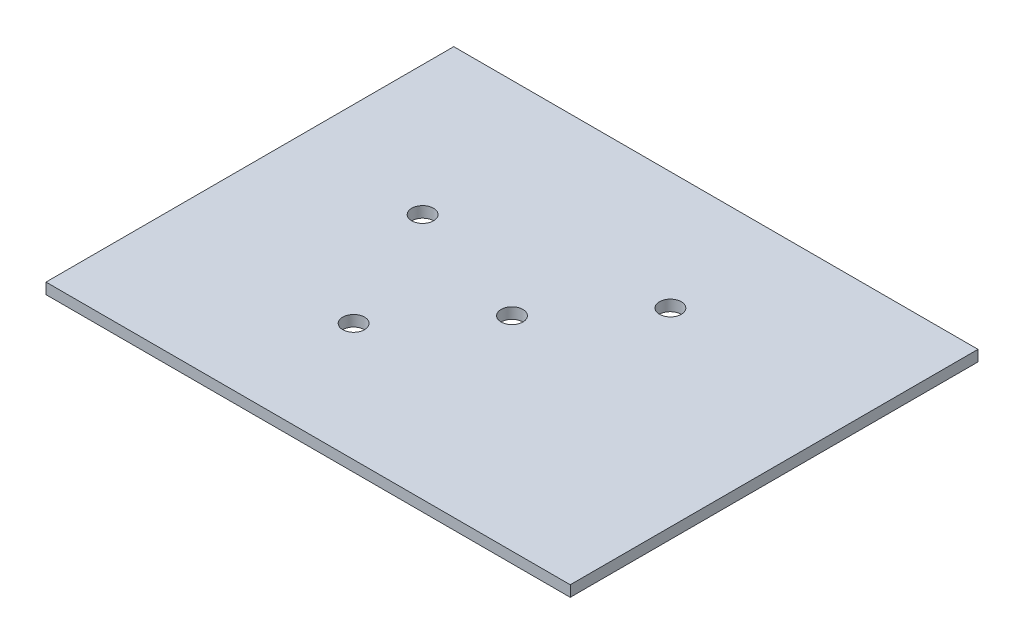
ISO-10303-21;
HEADER;
FILE_DESCRIPTION(('STEP AP214'),'2;1');
FILE_NAME('part.step','',(''),(''),'','','');
FILE_SCHEMA(('AUTOMOTIVE_DESIGN { 1 0 10303 214 1 1 1 1 }'));
ENDSEC;
DATA;
#1=APPLICATION_CONTEXT('core data for automotive mechanical design processes');
#2=APPLICATION_PROTOCOL_DEFINITION('international standard','automotive_design',2000,#1);
#3=PRODUCT_CONTEXT('',#1,'mechanical');
#4=PRODUCT('Part','Part','',(#3));
#5=PRODUCT_RELATED_PRODUCT_CATEGORY('part','',(#4));
#6=PRODUCT_DEFINITION_FORMATION('','',#4);
#7=PRODUCT_DEFINITION_CONTEXT('part definition',#1,'design');
#8=PRODUCT_DEFINITION('design','',#6,#7);
#9=PRODUCT_DEFINITION_SHAPE('','',#8);
#10=(LENGTH_UNIT() NAMED_UNIT(*) SI_UNIT(.MILLI.,.METRE.));
#11=(NAMED_UNIT(*) PLANE_ANGLE_UNIT() SI_UNIT($,.RADIAN.));
#12=(NAMED_UNIT(*) SI_UNIT($,.STERADIAN.) SOLID_ANGLE_UNIT());
#13=UNCERTAINTY_MEASURE_WITH_UNIT(LENGTH_MEASURE(1.E-05),#10,'distance_accuracy_value','');
#14=(GEOMETRIC_REPRESENTATION_CONTEXT(3) GLOBAL_UNCERTAINTY_ASSIGNED_CONTEXT((#13)) GLOBAL_UNIT_ASSIGNED_CONTEXT((#10,
#11,#12)) REPRESENTATION_CONTEXT('',''));
#15=CARTESIAN_POINT('',(0.,0.,0.));
#16=DIRECTION('',(0.,0.,1.));
#17=DIRECTION('',(1.,0.,0.));
#18=AXIS2_PLACEMENT_3D('',#15,#16,#17);
#19=CARTESIAN_POINT('',(-912.372794199772,9.525,-177.8));
#20=DIRECTION('',(0.,0.,-1.));
#21=DIRECTION('',(-1.,0.,0.));
#22=AXIS2_PLACEMENT_3D('',#19,#20,#21);
#23=PLANE('',#22);
#24=DIRECTION('',(1.,0.,0.));
#25=VECTOR('',#24,1.);
#26=CARTESIAN_POINT('',(-912.372794199772,0.,-177.8));
#27=LINE('',#26,#25);
#28=CARTESIAN_POINT('',(165.1,0.,-177.8));
#29=VERTEX_POINT('',#28);
#30=CARTESIAN_POINT('',(622.3,0.,-177.8));
#31=VERTEX_POINT('',#30);
#32=EDGE_CURVE('E39',#29,#31,#27,.T.);
#33=ORIENTED_EDGE('',*,*,#32,.F.);
#34=DIRECTION('',(0.,-1.,0.));
#35=VECTOR('',#34,1.);
#36=CARTESIAN_POINT('',(165.1,9.525,-177.8));
#37=LINE('',#36,#35);
#38=CARTESIAN_POINT('',(165.1,9.525,-177.8));
#39=VERTEX_POINT('',#38);
#40=EDGE_CURVE('E101',#39,#29,#37,.T.);
#41=ORIENTED_EDGE('',*,*,#40,.F.);
#42=DIRECTION('',(1.,0.,0.));
#43=VECTOR('',#42,1.);
#44=CARTESIAN_POINT('',(-912.372794199772,9.525,-177.8));
#45=LINE('',#44,#43);
#46=CARTESIAN_POINT('',(622.3,9.525,-177.8));
#47=VERTEX_POINT('',#46);
#48=EDGE_CURVE('E11',#39,#47,#45,.T.);
#49=ORIENTED_EDGE('',*,*,#48,.T.);
#50=DIRECTION('',(0.,-1.,0.));
#51=VECTOR('',#50,1.);
#52=CARTESIAN_POINT('',(622.3,9.525,-177.8));
#53=LINE('',#52,#51);
#54=EDGE_CURVE('E83',#47,#31,#53,.T.);
#55=ORIENTED_EDGE('',*,*,#54,.T.);
#56=EDGE_LOOP('',(#33,#41,#49,#55));
#57=FACE_BOUND('',#56,.T.);
#58=ADVANCED_FACE('F36',(#57),#23,.T.);
#59=CARTESIAN_POINT('',(-912.372794199772,9.525,0.));
#60=DIRECTION('',(0.,1.,0.));
#61=DIRECTION('',(0.,0.,1.));
#62=AXIS2_PLACEMENT_3D('',#59,#60,#61);
#63=PLANE('',#62);
#64=CARTESIAN_POINT('',(456.957959673768,9.525,-74.86832549825));
#65=DIRECTION('',(0.,-1.,0.));
#66=DIRECTION('',(0.,0.,-1.));
#67=AXIS2_PLACEMENT_3D('',#64,#65,#66);
#68=CIRCLE('',#67,9.52500000000002);
#69=CARTESIAN_POINT('',(456.957959673768,9.525,-84.39332549825));
#70=VERTEX_POINT('',#69);
#71=EDGE_CURVE('E105',#70,#70,#68,.T.);
#72=ORIENTED_EDGE('',*,*,#71,.T.);
#73=EDGE_LOOP('',(#72));
#74=FACE_BOUND('',#73,.T.);
#75=CARTESIAN_POINT('',(393.7,9.525,0.));
#76=DIRECTION('',(0.,-1.,0.));
#77=DIRECTION('',(0.,0.,-1.));
#78=AXIS2_PLACEMENT_3D('',#75,#76,#77);
#79=CIRCLE('',#78,9.52500000000002);
#80=CARTESIAN_POINT('',(393.7,9.525,-9.52500000000002));
#81=VERTEX_POINT('',#80);
#82=EDGE_CURVE('E111',#81,#81,#79,.T.);
#83=ORIENTED_EDGE('',*,*,#82,.T.);
#84=EDGE_LOOP('',(#83));
#85=FACE_BOUND('',#84,.T.);
#86=CARTESIAN_POINT('',(330.442040326232,9.525,74.8683254982502));
#87=DIRECTION('',(0.,-1.,0.));
#88=DIRECTION('',(0.,0.,-1.));
#89=AXIS2_PLACEMENT_3D('',#86,#87,#88);
#90=CIRCLE('',#89,9.52500000000002);
#91=CARTESIAN_POINT('',(330.442040326232,9.525,65.3433254982502));
#92=VERTEX_POINT('',#91);
#93=EDGE_CURVE('E117',#92,#92,#90,.T.);
#94=ORIENTED_EDGE('',*,*,#93,.T.);
#95=EDGE_LOOP('',(#94));
#96=FACE_BOUND('',#95,.T.);
#97=CARTESIAN_POINT('',(278.307280736003,9.525,-37.4463995713908));
#98=DIRECTION('',(0.,-1.,0.));
#99=DIRECTION('',(0.,0.,-1.));
#100=AXIS2_PLACEMENT_3D('',#97,#98,#99);
#101=CIRCLE('',#100,9.52500000000002);
#102=CARTESIAN_POINT('',(278.307280736003,9.525,-46.9713995713908));
#103=VERTEX_POINT('',#102);
#104=EDGE_CURVE('E123',#103,#103,#101,.T.);
#105=ORIENTED_EDGE('',*,*,#104,.T.);
#106=EDGE_LOOP('',(#105));
#107=FACE_BOUND('',#106,.T.);
#108=ORIENTED_EDGE('',*,*,#48,.F.);
#109=DIRECTION('',(0.,0.,-1.));
#110=VECTOR('',#109,1.);
#111=CARTESIAN_POINT('',(165.1,9.525,-450.66038433116));
#112=LINE('',#111,#110);
#113=CARTESIAN_POINT('',(165.1,9.525,177.8));
#114=VERTEX_POINT('',#113);
#115=EDGE_CURVE('E96',#114,#39,#112,.T.);
#116=ORIENTED_EDGE('',*,*,#115,.F.);
#117=DIRECTION('',(1.,0.,0.));
#118=VECTOR('',#117,1.);
#119=CARTESIAN_POINT('',(-912.372794199772,9.525,177.8));
#120=LINE('',#119,#118);
#121=CARTESIAN_POINT('',(622.3,9.525,177.8));
#122=VERTEX_POINT('',#121);
#123=EDGE_CURVE('E81',#114,#122,#120,.T.);
#124=ORIENTED_EDGE('',*,*,#123,.T.);
#125=DIRECTION('',(0.,0.,-1.));
#126=VECTOR('',#125,1.);
#127=CARTESIAN_POINT('',(622.299999999999,9.525,-450.66038433116));
#128=LINE('',#127,#126);
#129=EDGE_CURVE('E91',#122,#47,#128,.T.);
#130=ORIENTED_EDGE('',*,*,#129,.T.);
#131=EDGE_LOOP('',(#108,#116,#124,#130));
#132=FACE_BOUND('',#131,.T.);
#133=ADVANCED_FACE('F134',(#74,#85,#96,#107,#132),#63,.T.);
#134=CARTESIAN_POINT('',(-912.372794199772,0.,0.));
#135=DIRECTION('',(0.,1.,0.));
#136=DIRECTION('',(0.,0.,1.));
#137=AXIS2_PLACEMENT_3D('',#134,#135,#136);
#138=PLANE('',#137);
#139=CARTESIAN_POINT('',(456.957959673768,0.,-74.86832549825));
#140=DIRECTION('',(0.,-1.,0.));
#141=DIRECTION('',(0.,0.,-1.));
#142=AXIS2_PLACEMENT_3D('',#139,#140,#141);
#143=CIRCLE('',#142,9.52500000000002);
#144=CARTESIAN_POINT('',(456.957959673768,0.,-84.39332549825));
#145=VERTEX_POINT('',#144);
#146=EDGE_CURVE('E103',#145,#145,#143,.T.);
#147=ORIENTED_EDGE('',*,*,#146,.F.);
#148=EDGE_LOOP('',(#147));
#149=FACE_BOUND('',#148,.T.);
#150=CARTESIAN_POINT('',(393.7,0.,0.));
#151=DIRECTION('',(0.,-1.,0.));
#152=DIRECTION('',(0.,0.,-1.));
#153=AXIS2_PLACEMENT_3D('',#150,#151,#152);
#154=CIRCLE('',#153,9.52500000000002);
#155=CARTESIAN_POINT('',(393.7,0.,-9.52500000000002));
#156=VERTEX_POINT('',#155);
#157=EDGE_CURVE('E108',#156,#156,#154,.T.);
#158=ORIENTED_EDGE('',*,*,#157,.F.);
#159=EDGE_LOOP('',(#158));
#160=FACE_BOUND('',#159,.T.);
#161=CARTESIAN_POINT('',(330.442040326232,0.,74.8683254982502));
#162=DIRECTION('',(0.,-1.,0.));
#163=DIRECTION('',(0.,0.,-1.));
#164=AXIS2_PLACEMENT_3D('',#161,#162,#163);
#165=CIRCLE('',#164,9.52500000000002);
#166=CARTESIAN_POINT('',(330.442040326232,0.,65.3433254982502));
#167=VERTEX_POINT('',#166);
#168=EDGE_CURVE('E114',#167,#167,#165,.T.);
#169=ORIENTED_EDGE('',*,*,#168,.F.);
#170=EDGE_LOOP('',(#169));
#171=FACE_BOUND('',#170,.T.);
#172=CARTESIAN_POINT('',(278.307280736003,0.,-37.4463995713908));
#173=DIRECTION('',(0.,-1.,0.));
#174=DIRECTION('',(0.,0.,-1.));
#175=AXIS2_PLACEMENT_3D('',#172,#173,#174);
#176=CIRCLE('',#175,9.52500000000002);
#177=CARTESIAN_POINT('',(278.307280736003,0.,-46.9713995713908));
#178=VERTEX_POINT('',#177);
#179=EDGE_CURVE('E120',#178,#178,#176,.T.);
#180=ORIENTED_EDGE('',*,*,#179,.F.);
#181=EDGE_LOOP('',(#180));
#182=FACE_BOUND('',#181,.T.);
#183=DIRECTION('',(1.,0.,0.));
#184=VECTOR('',#183,1.);
#185=CARTESIAN_POINT('',(-912.372794199772,0.,177.8));
#186=LINE('',#185,#184);
#187=CARTESIAN_POINT('',(165.1,0.,177.8));
#188=VERTEX_POINT('',#187);
#189=CARTESIAN_POINT('',(622.3,0.,177.8));
#190=VERTEX_POINT('',#189);
#191=EDGE_CURVE('E62',#188,#190,#186,.T.);
#192=ORIENTED_EDGE('',*,*,#191,.F.);
#193=DIRECTION('',(0.,0.,-1.));
#194=VECTOR('',#193,1.);
#195=CARTESIAN_POINT('',(165.1,0.,-450.66038433116));
#196=LINE('',#195,#194);
#197=EDGE_CURVE('E79',#188,#29,#196,.T.);
#198=ORIENTED_EDGE('',*,*,#197,.T.);
#199=ORIENTED_EDGE('',*,*,#32,.T.);
#200=DIRECTION('',(0.,0.,-1.));
#201=VECTOR('',#200,1.);
#202=CARTESIAN_POINT('',(622.299999999999,0.,-450.66038433116));
#203=LINE('',#202,#201);
#204=EDGE_CURVE('E77',#190,#31,#203,.T.);
#205=ORIENTED_EDGE('',*,*,#204,.F.);
#206=EDGE_LOOP('',(#192,#198,#199,#205));
#207=FACE_BOUND('',#206,.T.);
#208=ADVANCED_FACE('F75',(#149,#160,#171,#182,#207),#138,.F.);
#209=CARTESIAN_POINT('',(-912.372794199772,9.525,177.8));
#210=DIRECTION('',(0.,0.,-1.));
#211=DIRECTION('',(-1.,0.,0.));
#212=AXIS2_PLACEMENT_3D('',#209,#210,#211);
#213=PLANE('',#212);
#214=ORIENTED_EDGE('',*,*,#191,.T.);
#215=DIRECTION('',(0.,-1.,0.));
#216=VECTOR('',#215,1.);
#217=CARTESIAN_POINT('',(622.3,9.525,177.8));
#218=LINE('',#217,#216);
#219=EDGE_CURVE('E86',#122,#190,#218,.T.);
#220=ORIENTED_EDGE('',*,*,#219,.F.);
#221=ORIENTED_EDGE('',*,*,#123,.F.);
#222=DIRECTION('',(0.,-1.,0.));
#223=VECTOR('',#222,1.);
#224=CARTESIAN_POINT('',(165.1,9.525,177.8));
#225=LINE('',#224,#223);
#226=EDGE_CURVE('E99',#114,#188,#225,.T.);
#227=ORIENTED_EDGE('',*,*,#226,.T.);
#228=EDGE_LOOP('',(#214,#220,#221,#227));
#229=FACE_BOUND('',#228,.T.);
#230=ADVANCED_FACE('F130',(#229),#213,.F.);
#231=CARTESIAN_POINT('',(278.307280736003,9.525,-37.4463995713908));
#232=DIRECTION('',(0.,-1.,0.));
#233=DIRECTION('',(0.,0.,-1.));
#234=AXIS2_PLACEMENT_3D('',#231,#232,#233);
#235=CYLINDRICAL_SURFACE('',#234,9.52500000000002);
#236=CARTESIAN_POINT('',(278.307280736003,9.525,-46.9713995713908));
#237=CARTESIAN_POINT('',(278.307280736003,9.42578125,-46.9713995713908));
#238=CARTESIAN_POINT('',(278.307280736003,9.3265625,-46.9713995713908));
#239=CARTESIAN_POINT('',(278.307280736003,9.128125,-46.9713995713908));
#240=CARTESIAN_POINT('',(278.307280736003,9.02890625,-46.9713995713908));
#241=CARTESIAN_POINT('',(278.307280736003,8.83046875,-46.9713995713908));
#242=CARTESIAN_POINT('',(278.307280736003,8.73125,-46.9713995713908));
#243=CARTESIAN_POINT('',(278.307280736003,8.5328125,-46.9713995713908));
#244=CARTESIAN_POINT('',(278.307280736003,8.43359375,-46.9713995713908));
#245=CARTESIAN_POINT('',(278.307280736003,8.23515625,-46.9713995713908));
#246=CARTESIAN_POINT('',(278.307280736003,8.1359375,-46.9713995713908));
#247=CARTESIAN_POINT('',(278.307280736003,7.9375,-46.9713995713908));
#248=CARTESIAN_POINT('',(278.307280736003,7.83828125,-46.9713995713908));
#249=CARTESIAN_POINT('',(278.307280736003,7.63984375,-46.9713995713908));
#250=CARTESIAN_POINT('',(278.307280736003,7.540625,-46.9713995713908));
#251=CARTESIAN_POINT('',(278.307280736003,7.3421875,-46.9713995713908));
#252=CARTESIAN_POINT('',(278.307280736003,7.24296875,-46.9713995713908));
#253=CARTESIAN_POINT('',(278.307280736003,7.04453125,-46.9713995713908));
#254=CARTESIAN_POINT('',(278.307280736003,6.9453125,-46.9713995713908));
#255=CARTESIAN_POINT('',(278.307280736003,6.746875,-46.9713995713908));
#256=CARTESIAN_POINT('',(278.307280736003,6.64765625,-46.9713995713908));
#257=CARTESIAN_POINT('',(278.307280736003,6.44921875,-46.9713995713908));
#258=CARTESIAN_POINT('',(278.307280736003,6.35,-46.9713995713908));
#259=CARTESIAN_POINT('',(278.307280736003,6.1515625,-46.9713995713908));
#260=CARTESIAN_POINT('',(278.307280736003,6.05234375,-46.9713995713908));
#261=CARTESIAN_POINT('',(278.307280736003,5.85390625,-46.9713995713908));
#262=CARTESIAN_POINT('',(278.307280736003,5.7546875,-46.9713995713908));
#263=CARTESIAN_POINT('',(278.307280736003,5.55625,-46.9713995713908));
#264=CARTESIAN_POINT('',(278.307280736003,5.45703125,-46.9713995713908));
#265=CARTESIAN_POINT('',(278.307280736003,5.25859375,-46.9713995713908));
#266=CARTESIAN_POINT('',(278.307280736003,5.159375,-46.9713995713908));
#267=CARTESIAN_POINT('',(278.307280736003,4.9609375,-46.9713995713908));
#268=CARTESIAN_POINT('',(278.307280736003,4.86171875,-46.9713995713908));
#269=CARTESIAN_POINT('',(278.307280736003,4.66328125,-46.9713995713908));
#270=CARTESIAN_POINT('',(278.307280736003,4.5640625,-46.9713995713908));
#271=CARTESIAN_POINT('',(278.307280736003,4.365625,-46.9713995713908));
#272=CARTESIAN_POINT('',(278.307280736003,4.26640625,-46.9713995713908));
#273=CARTESIAN_POINT('',(278.307280736003,4.06796875,-46.9713995713908));
#274=CARTESIAN_POINT('',(278.307280736003,3.96875,-46.9713995713908));
#275=CARTESIAN_POINT('',(278.307280736003,3.7703125,-46.9713995713908));
#276=CARTESIAN_POINT('',(278.307280736003,3.67109375,-46.9713995713908));
#277=CARTESIAN_POINT('',(278.307280736003,3.47265625,-46.9713995713908));
#278=CARTESIAN_POINT('',(278.307280736003,3.3734375,-46.9713995713908));
#279=CARTESIAN_POINT('',(278.307280736003,3.175,-46.9713995713908));
#280=CARTESIAN_POINT('',(278.307280736003,3.07578125,-46.9713995713908));
#281=CARTESIAN_POINT('',(278.307280736003,2.87734375,-46.9713995713908));
#282=CARTESIAN_POINT('',(278.307280736003,2.778125,-46.9713995713908));
#283=CARTESIAN_POINT('',(278.307280736003,2.5796875,-46.9713995713908));
#284=CARTESIAN_POINT('',(278.307280736003,2.48046875,-46.9713995713908));
#285=CARTESIAN_POINT('',(278.307280736003,2.28203125,-46.9713995713908));
#286=CARTESIAN_POINT('',(278.307280736003,2.1828125,-46.9713995713908));
#287=CARTESIAN_POINT('',(278.307280736003,1.984375,-46.9713995713908));
#288=CARTESIAN_POINT('',(278.307280736003,1.88515625,-46.9713995713908));
#289=CARTESIAN_POINT('',(278.307280736003,1.68671875,-46.9713995713908));
#290=CARTESIAN_POINT('',(278.307280736003,1.5875,-46.9713995713908));
#291=CARTESIAN_POINT('',(278.307280736003,1.3890625,-46.9713995713908));
#292=CARTESIAN_POINT('',(278.307280736003,1.28984375,-46.9713995713908));
#293=CARTESIAN_POINT('',(278.307280736003,1.09140625,-46.9713995713908));
#294=CARTESIAN_POINT('',(278.307280736003,0.992187500000001,-46.9713995713908));
#295=CARTESIAN_POINT('',(278.307280736003,0.793750000000001,-46.9713995713908));
#296=CARTESIAN_POINT('',(278.307280736003,0.69453125,-46.9713995713908));
#297=CARTESIAN_POINT('',(278.307280736003,0.49609375,-46.9713995713908));
#298=CARTESIAN_POINT('',(278.307280736003,0.396875,-46.9713995713908));
#299=CARTESIAN_POINT('',(278.307280736003,0.1984375,-46.9713995713908));
#300=CARTESIAN_POINT('',(278.307280736003,0.0992187500000001,-46.9713995713908));
#301=CARTESIAN_POINT('',(278.307280736003,0.,-46.9713995713908));
#302=B_SPLINE_CURVE_WITH_KNOTS('',3,(#236,#237,#238,#239,#240,#241,#242,#243,#244,#245,#246,
#247,#248,#249,#250,#251,#252,#253,#254,#255,#256,#257,#258,#259,#260,#261,#262,#263,#264,#265,
#266,#267,#268,#269,#270,#271,#272,#273,#274,#275,#276,#277,#278,#279,#280,#281,#282,#283,#284,
#285,#286,#287,#288,#289,#290,#291,#292,#293,#294,#295,#296,#297,#298,#299,#300,#301),
.UNSPECIFIED.,.F.,.F.,(4,2,2,2,2,2,2,2,2,2,2,2,2,2,2,2,2,2,2,2,2,2,2,2,2,2,2,2,2,2,2,2,4),(0.,
0.29765625,0.5953125,0.892968750000001,1.190625,1.48828125,1.7859375,2.08359375,2.38125,
2.67890625,2.9765625,3.27421875,3.571875,3.86953125,4.1671875,4.46484375,4.7625,5.06015625,
5.3578125,5.65546875,5.953125,6.25078125,6.5484375,6.84609375,7.14375,7.44140625,7.7390625,
8.03671875,8.334375,8.63203125,8.9296875,9.22734375,9.525),.UNSPECIFIED.);
#303=EDGE_CURVE('BSEAM147',#103,#178,#302,.T.);
#304=ORIENTED_EDGE('',*,*,#104,.F.);
#305=ORIENTED_EDGE('',*,*,#179,.T.);
#306=ORIENTED_EDGE('',*,*,#303,.T.);
#307=ORIENTED_EDGE('',*,*,#303,.F.);
#308=EDGE_LOOP('',(#304,#306,#305,#307));
#309=FACE_BOUND('',#308,.T.);
#310=ADVANCED_FACE('F147',(#309),#235,.F.);
#311=CARTESIAN_POINT('',(330.442040326232,9.525,74.8683254982502));
#312=DIRECTION('',(0.,-1.,0.));
#313=DIRECTION('',(0.,0.,-1.));
#314=AXIS2_PLACEMENT_3D('',#311,#312,#313);
#315=CYLINDRICAL_SURFACE('',#314,9.52500000000002);
#316=CARTESIAN_POINT('',(330.442040326232,9.525,65.3433254982502));
#317=CARTESIAN_POINT('',(330.442040326232,9.42578125,65.3433254982502));
#318=CARTESIAN_POINT('',(330.442040326232,9.3265625,65.3433254982502));
#319=CARTESIAN_POINT('',(330.442040326232,9.128125,65.3433254982502));
#320=CARTESIAN_POINT('',(330.442040326232,9.02890625,65.3433254982502));
#321=CARTESIAN_POINT('',(330.442040326232,8.83046875,65.3433254982502));
#322=CARTESIAN_POINT('',(330.442040326232,8.73125,65.3433254982502));
#323=CARTESIAN_POINT('',(330.442040326232,8.5328125,65.3433254982502));
#324=CARTESIAN_POINT('',(330.442040326232,8.43359375,65.3433254982502));
#325=CARTESIAN_POINT('',(330.442040326232,8.23515625,65.3433254982502));
#326=CARTESIAN_POINT('',(330.442040326232,8.1359375,65.3433254982502));
#327=CARTESIAN_POINT('',(330.442040326232,7.9375,65.3433254982502));
#328=CARTESIAN_POINT('',(330.442040326232,7.83828125,65.3433254982502));
#329=CARTESIAN_POINT('',(330.442040326232,7.63984375,65.3433254982502));
#330=CARTESIAN_POINT('',(330.442040326232,7.540625,65.3433254982502));
#331=CARTESIAN_POINT('',(330.442040326232,7.3421875,65.3433254982502));
#332=CARTESIAN_POINT('',(330.442040326232,7.24296875,65.3433254982502));
#333=CARTESIAN_POINT('',(330.442040326232,7.04453125,65.3433254982502));
#334=CARTESIAN_POINT('',(330.442040326232,6.9453125,65.3433254982502));
#335=CARTESIAN_POINT('',(330.442040326232,6.746875,65.3433254982502));
#336=CARTESIAN_POINT('',(330.442040326232,6.64765625,65.3433254982502));
#337=CARTESIAN_POINT('',(330.442040326232,6.44921875,65.3433254982502));
#338=CARTESIAN_POINT('',(330.442040326232,6.35,65.3433254982502));
#339=CARTESIAN_POINT('',(330.442040326232,6.1515625,65.3433254982502));
#340=CARTESIAN_POINT('',(330.442040326232,6.05234375,65.3433254982502));
#341=CARTESIAN_POINT('',(330.442040326232,5.85390625,65.3433254982502));
#342=CARTESIAN_POINT('',(330.442040326232,5.7546875,65.3433254982502));
#343=CARTESIAN_POINT('',(330.442040326232,5.55625,65.3433254982502));
#344=CARTESIAN_POINT('',(330.442040326232,5.45703125,65.3433254982502));
#345=CARTESIAN_POINT('',(330.442040326232,5.25859375,65.3433254982502));
#346=CARTESIAN_POINT('',(330.442040326232,5.159375,65.3433254982502));
#347=CARTESIAN_POINT('',(330.442040326232,4.9609375,65.3433254982502));
#348=CARTESIAN_POINT('',(330.442040326232,4.86171875,65.3433254982502));
#349=CARTESIAN_POINT('',(330.442040326232,4.66328125,65.3433254982502));
#350=CARTESIAN_POINT('',(330.442040326232,4.5640625,65.3433254982502));
#351=CARTESIAN_POINT('',(330.442040326232,4.365625,65.3433254982502));
#352=CARTESIAN_POINT('',(330.442040326232,4.26640625,65.3433254982502));
#353=CARTESIAN_POINT('',(330.442040326232,4.06796875,65.3433254982502));
#354=CARTESIAN_POINT('',(330.442040326232,3.96875,65.3433254982502));
#355=CARTESIAN_POINT('',(330.442040326232,3.7703125,65.3433254982502));
#356=CARTESIAN_POINT('',(330.442040326232,3.67109375,65.3433254982502));
#357=CARTESIAN_POINT('',(330.442040326232,3.47265625,65.3433254982502));
#358=CARTESIAN_POINT('',(330.442040326232,3.3734375,65.3433254982502));
#359=CARTESIAN_POINT('',(330.442040326232,3.175,65.3433254982502));
#360=CARTESIAN_POINT('',(330.442040326232,3.07578125,65.3433254982502));
#361=CARTESIAN_POINT('',(330.442040326232,2.87734375,65.3433254982502));
#362=CARTESIAN_POINT('',(330.442040326232,2.778125,65.3433254982502));
#363=CARTESIAN_POINT('',(330.442040326232,2.5796875,65.3433254982502));
#364=CARTESIAN_POINT('',(330.442040326232,2.48046875,65.3433254982502));
#365=CARTESIAN_POINT('',(330.442040326232,2.28203125,65.3433254982502));
#366=CARTESIAN_POINT('',(330.442040326232,2.1828125,65.3433254982502));
#367=CARTESIAN_POINT('',(330.442040326232,1.984375,65.3433254982502));
#368=CARTESIAN_POINT('',(330.442040326232,1.88515625,65.3433254982502));
#369=CARTESIAN_POINT('',(330.442040326232,1.68671875,65.3433254982502));
#370=CARTESIAN_POINT('',(330.442040326232,1.5875,65.3433254982502));
#371=CARTESIAN_POINT('',(330.442040326232,1.3890625,65.3433254982502));
#372=CARTESIAN_POINT('',(330.442040326232,1.28984375,65.3433254982502));
#373=CARTESIAN_POINT('',(330.442040326232,1.09140625,65.3433254982502));
#374=CARTESIAN_POINT('',(330.442040326232,0.992187500000001,65.3433254982502));
#375=CARTESIAN_POINT('',(330.442040326232,0.793750000000001,65.3433254982502));
#376=CARTESIAN_POINT('',(330.442040326232,0.69453125,65.3433254982502));
#377=CARTESIAN_POINT('',(330.442040326232,0.49609375,65.3433254982502));
#378=CARTESIAN_POINT('',(330.442040326232,0.396875,65.3433254982502));
#379=CARTESIAN_POINT('',(330.442040326232,0.1984375,65.3433254982502));
#380=CARTESIAN_POINT('',(330.442040326232,0.0992187500000001,65.3433254982502));
#381=CARTESIAN_POINT('',(330.442040326232,0.,65.3433254982502));
#382=B_SPLINE_CURVE_WITH_KNOTS('',3,(#316,#317,#318,#319,#320,#321,#322,#323,#324,#325,#326,
#327,#328,#329,#330,#331,#332,#333,#334,#335,#336,#337,#338,#339,#340,#341,#342,#343,#344,#345,
#346,#347,#348,#349,#350,#351,#352,#353,#354,#355,#356,#357,#358,#359,#360,#361,#362,#363,#364,
#365,#366,#367,#368,#369,#370,#371,#372,#373,#374,#375,#376,#377,#378,#379,#380,#381),
.UNSPECIFIED.,.F.,.F.,(4,2,2,2,2,2,2,2,2,2,2,2,2,2,2,2,2,2,2,2,2,2,2,2,2,2,2,2,2,2,2,2,4),(0.,
0.29765625,0.5953125,0.892968750000001,1.190625,1.48828125,1.7859375,2.08359375,2.38125,
2.67890625,2.9765625,3.27421875,3.571875,3.86953125,4.1671875,4.46484375,4.7625,5.06015625,
5.3578125,5.65546875,5.953125,6.25078125,6.5484375,6.84609375,7.14375,7.44140625,7.7390625,
8.03671875,8.334375,8.63203125,8.9296875,9.22734375,9.525),.UNSPECIFIED.);
#383=EDGE_CURVE('BSEAM150',#92,#167,#382,.T.);
#384=ORIENTED_EDGE('',*,*,#93,.F.);
#385=ORIENTED_EDGE('',*,*,#168,.T.);
#386=ORIENTED_EDGE('',*,*,#383,.T.);
#387=ORIENTED_EDGE('',*,*,#383,.F.);
#388=EDGE_LOOP('',(#384,#386,#385,#387));
#389=FACE_BOUND('',#388,.T.);
#390=ADVANCED_FACE('F150',(#389),#315,.F.);
#391=CARTESIAN_POINT('',(393.7,9.525,0.));
#392=DIRECTION('',(0.,-1.,0.));
#393=DIRECTION('',(0.,0.,-1.));
#394=AXIS2_PLACEMENT_3D('',#391,#392,#393);
#395=CYLINDRICAL_SURFACE('',#394,9.52500000000002);
#396=CARTESIAN_POINT('',(393.7,9.525,-9.52500000000002));
#397=CARTESIAN_POINT('',(393.7,9.42578125,-9.52500000000002));
#398=CARTESIAN_POINT('',(393.7,9.3265625,-9.52500000000002));
#399=CARTESIAN_POINT('',(393.7,9.128125,-9.52500000000002));
#400=CARTESIAN_POINT('',(393.7,9.02890625,-9.52500000000002));
#401=CARTESIAN_POINT('',(393.7,8.83046875,-9.52500000000002));
#402=CARTESIAN_POINT('',(393.7,8.73125,-9.52500000000002));
#403=CARTESIAN_POINT('',(393.7,8.5328125,-9.52500000000002));
#404=CARTESIAN_POINT('',(393.7,8.43359375,-9.52500000000002));
#405=CARTESIAN_POINT('',(393.7,8.23515625,-9.52500000000002));
#406=CARTESIAN_POINT('',(393.7,8.1359375,-9.52500000000002));
#407=CARTESIAN_POINT('',(393.7,7.9375,-9.52500000000002));
#408=CARTESIAN_POINT('',(393.7,7.83828125,-9.52500000000002));
#409=CARTESIAN_POINT('',(393.7,7.63984375,-9.52500000000002));
#410=CARTESIAN_POINT('',(393.7,7.540625,-9.52500000000002));
#411=CARTESIAN_POINT('',(393.7,7.3421875,-9.52500000000002));
#412=CARTESIAN_POINT('',(393.7,7.24296875,-9.52500000000002));
#413=CARTESIAN_POINT('',(393.7,7.04453125,-9.52500000000002));
#414=CARTESIAN_POINT('',(393.7,6.9453125,-9.52500000000002));
#415=CARTESIAN_POINT('',(393.7,6.746875,-9.52500000000002));
#416=CARTESIAN_POINT('',(393.7,6.64765625,-9.52500000000002));
#417=CARTESIAN_POINT('',(393.7,6.44921875,-9.52500000000002));
#418=CARTESIAN_POINT('',(393.7,6.35,-9.52500000000002));
#419=CARTESIAN_POINT('',(393.7,6.1515625,-9.52500000000002));
#420=CARTESIAN_POINT('',(393.7,6.05234375,-9.52500000000002));
#421=CARTESIAN_POINT('',(393.7,5.85390625,-9.52500000000002));
#422=CARTESIAN_POINT('',(393.7,5.7546875,-9.52500000000002));
#423=CARTESIAN_POINT('',(393.7,5.55625,-9.52500000000002));
#424=CARTESIAN_POINT('',(393.7,5.45703125,-9.52500000000002));
#425=CARTESIAN_POINT('',(393.7,5.25859375,-9.52500000000002));
#426=CARTESIAN_POINT('',(393.7,5.159375,-9.52500000000002));
#427=CARTESIAN_POINT('',(393.7,4.9609375,-9.52500000000002));
#428=CARTESIAN_POINT('',(393.7,4.86171875,-9.52500000000002));
#429=CARTESIAN_POINT('',(393.7,4.66328125,-9.52500000000002));
#430=CARTESIAN_POINT('',(393.7,4.5640625,-9.52500000000002));
#431=CARTESIAN_POINT('',(393.7,4.365625,-9.52500000000002));
#432=CARTESIAN_POINT('',(393.7,4.26640625,-9.52500000000002));
#433=CARTESIAN_POINT('',(393.7,4.06796875,-9.52500000000002));
#434=CARTESIAN_POINT('',(393.7,3.96875,-9.52500000000002));
#435=CARTESIAN_POINT('',(393.7,3.7703125,-9.52500000000002));
#436=CARTESIAN_POINT('',(393.7,3.67109375,-9.52500000000002));
#437=CARTESIAN_POINT('',(393.7,3.47265625,-9.52500000000002));
#438=CARTESIAN_POINT('',(393.7,3.3734375,-9.52500000000002));
#439=CARTESIAN_POINT('',(393.7,3.175,-9.52500000000002));
#440=CARTESIAN_POINT('',(393.7,3.07578125,-9.52500000000002));
#441=CARTESIAN_POINT('',(393.7,2.87734375,-9.52500000000002));
#442=CARTESIAN_POINT('',(393.7,2.778125,-9.52500000000002));
#443=CARTESIAN_POINT('',(393.7,2.5796875,-9.52500000000002));
#444=CARTESIAN_POINT('',(393.7,2.48046875,-9.52500000000002));
#445=CARTESIAN_POINT('',(393.7,2.28203125,-9.52500000000002));
#446=CARTESIAN_POINT('',(393.7,2.1828125,-9.52500000000002));
#447=CARTESIAN_POINT('',(393.7,1.984375,-9.52500000000002));
#448=CARTESIAN_POINT('',(393.7,1.88515625,-9.52500000000002));
#449=CARTESIAN_POINT('',(393.7,1.68671875,-9.52500000000002));
#450=CARTESIAN_POINT('',(393.7,1.5875,-9.52500000000002));
#451=CARTESIAN_POINT('',(393.7,1.3890625,-9.52500000000002));
#452=CARTESIAN_POINT('',(393.7,1.28984375,-9.52500000000002));
#453=CARTESIAN_POINT('',(393.7,1.09140625,-9.52500000000002));
#454=CARTESIAN_POINT('',(393.7,0.992187500000001,-9.52500000000002));
#455=CARTESIAN_POINT('',(393.7,0.793750000000001,-9.52500000000002));
#456=CARTESIAN_POINT('',(393.7,0.69453125,-9.52500000000002));
#457=CARTESIAN_POINT('',(393.7,0.49609375,-9.52500000000002));
#458=CARTESIAN_POINT('',(393.7,0.396875,-9.52500000000002));
#459=CARTESIAN_POINT('',(393.7,0.1984375,-9.52500000000002));
#460=CARTESIAN_POINT('',(393.7,0.0992187500000001,-9.52500000000002));
#461=CARTESIAN_POINT('',(393.7,0.,-9.52500000000002));
#462=B_SPLINE_CURVE_WITH_KNOTS('',3,(#396,#397,#398,#399,#400,#401,#402,#403,#404,#405,#406,
#407,#408,#409,#410,#411,#412,#413,#414,#415,#416,#417,#418,#419,#420,#421,#422,#423,#424,#425,
#426,#427,#428,#429,#430,#431,#432,#433,#434,#435,#436,#437,#438,#439,#440,#441,#442,#443,#444,
#445,#446,#447,#448,#449,#450,#451,#452,#453,#454,#455,#456,#457,#458,#459,#460,#461),
.UNSPECIFIED.,.F.,.F.,(4,2,2,2,2,2,2,2,2,2,2,2,2,2,2,2,2,2,2,2,2,2,2,2,2,2,2,2,2,2,2,2,4),(0.,
0.29765625,0.5953125,0.892968750000001,1.190625,1.48828125,1.7859375,2.08359375,2.38125,
2.67890625,2.9765625,3.27421875,3.571875,3.86953125,4.1671875,4.46484375,4.7625,5.06015625,
5.3578125,5.65546875,5.953125,6.25078125,6.5484375,6.84609375,7.14375,7.44140625,7.7390625,
8.03671875,8.334375,8.63203125,8.9296875,9.22734375,9.525),.UNSPECIFIED.);
#463=EDGE_CURVE('BSEAM154',#81,#156,#462,.T.);
#464=ORIENTED_EDGE('',*,*,#82,.F.);
#465=ORIENTED_EDGE('',*,*,#157,.T.);
#466=ORIENTED_EDGE('',*,*,#463,.T.);
#467=ORIENTED_EDGE('',*,*,#463,.F.);
#468=EDGE_LOOP('',(#464,#466,#465,#467));
#469=FACE_BOUND('',#468,.T.);
#470=ADVANCED_FACE('F154',(#469),#395,.F.);
#471=CARTESIAN_POINT('',(456.957959673768,9.525,-74.86832549825));
#472=DIRECTION('',(0.,-1.,0.));
#473=DIRECTION('',(0.,0.,-1.));
#474=AXIS2_PLACEMENT_3D('',#471,#472,#473);
#475=CYLINDRICAL_SURFACE('',#474,9.52500000000002);
#476=CARTESIAN_POINT('',(456.957959673768,9.525,-84.39332549825));
#477=CARTESIAN_POINT('',(456.957959673768,9.42578125,-84.39332549825));
#478=CARTESIAN_POINT('',(456.957959673768,9.3265625,-84.39332549825));
#479=CARTESIAN_POINT('',(456.957959673768,9.128125,-84.39332549825));
#480=CARTESIAN_POINT('',(456.957959673768,9.02890625,-84.39332549825));
#481=CARTESIAN_POINT('',(456.957959673768,8.83046875,-84.39332549825));
#482=CARTESIAN_POINT('',(456.957959673768,8.73125,-84.39332549825));
#483=CARTESIAN_POINT('',(456.957959673768,8.5328125,-84.39332549825));
#484=CARTESIAN_POINT('',(456.957959673768,8.43359375,-84.39332549825));
#485=CARTESIAN_POINT('',(456.957959673768,8.23515625,-84.39332549825));
#486=CARTESIAN_POINT('',(456.957959673768,8.1359375,-84.39332549825));
#487=CARTESIAN_POINT('',(456.957959673768,7.9375,-84.39332549825));
#488=CARTESIAN_POINT('',(456.957959673768,7.83828125,-84.39332549825));
#489=CARTESIAN_POINT('',(456.957959673768,7.63984375,-84.39332549825));
#490=CARTESIAN_POINT('',(456.957959673768,7.540625,-84.39332549825));
#491=CARTESIAN_POINT('',(456.957959673768,7.3421875,-84.39332549825));
#492=CARTESIAN_POINT('',(456.957959673768,7.24296875,-84.39332549825));
#493=CARTESIAN_POINT('',(456.957959673768,7.04453125,-84.39332549825));
#494=CARTESIAN_POINT('',(456.957959673768,6.9453125,-84.39332549825));
#495=CARTESIAN_POINT('',(456.957959673768,6.746875,-84.39332549825));
#496=CARTESIAN_POINT('',(456.957959673768,6.64765625,-84.39332549825));
#497=CARTESIAN_POINT('',(456.957959673768,6.44921875,-84.39332549825));
#498=CARTESIAN_POINT('',(456.957959673768,6.35,-84.39332549825));
#499=CARTESIAN_POINT('',(456.957959673768,6.1515625,-84.39332549825));
#500=CARTESIAN_POINT('',(456.957959673768,6.05234375,-84.39332549825));
#501=CARTESIAN_POINT('',(456.957959673768,5.85390625,-84.39332549825));
#502=CARTESIAN_POINT('',(456.957959673768,5.7546875,-84.39332549825));
#503=CARTESIAN_POINT('',(456.957959673768,5.55625,-84.39332549825));
#504=CARTESIAN_POINT('',(456.957959673768,5.45703125,-84.39332549825));
#505=CARTESIAN_POINT('',(456.957959673768,5.25859375,-84.39332549825));
#506=CARTESIAN_POINT('',(456.957959673768,5.159375,-84.39332549825));
#507=CARTESIAN_POINT('',(456.957959673768,4.9609375,-84.39332549825));
#508=CARTESIAN_POINT('',(456.957959673768,4.86171875,-84.39332549825));
#509=CARTESIAN_POINT('',(456.957959673768,4.66328125,-84.39332549825));
#510=CARTESIAN_POINT('',(456.957959673768,4.5640625,-84.39332549825));
#511=CARTESIAN_POINT('',(456.957959673768,4.365625,-84.39332549825));
#512=CARTESIAN_POINT('',(456.957959673768,4.26640625,-84.39332549825));
#513=CARTESIAN_POINT('',(456.957959673768,4.06796875,-84.39332549825));
#514=CARTESIAN_POINT('',(456.957959673768,3.96875,-84.39332549825));
#515=CARTESIAN_POINT('',(456.957959673768,3.7703125,-84.39332549825));
#516=CARTESIAN_POINT('',(456.957959673768,3.67109375,-84.39332549825));
#517=CARTESIAN_POINT('',(456.957959673768,3.47265625,-84.39332549825));
#518=CARTESIAN_POINT('',(456.957959673768,3.3734375,-84.39332549825));
#519=CARTESIAN_POINT('',(456.957959673768,3.175,-84.39332549825));
#520=CARTESIAN_POINT('',(456.957959673768,3.07578125,-84.39332549825));
#521=CARTESIAN_POINT('',(456.957959673768,2.87734375,-84.39332549825));
#522=CARTESIAN_POINT('',(456.957959673768,2.778125,-84.39332549825));
#523=CARTESIAN_POINT('',(456.957959673768,2.5796875,-84.39332549825));
#524=CARTESIAN_POINT('',(456.957959673768,2.48046875,-84.39332549825));
#525=CARTESIAN_POINT('',(456.957959673768,2.28203125,-84.39332549825));
#526=CARTESIAN_POINT('',(456.957959673768,2.1828125,-84.39332549825));
#527=CARTESIAN_POINT('',(456.957959673768,1.984375,-84.39332549825));
#528=CARTESIAN_POINT('',(456.957959673768,1.88515625,-84.39332549825));
#529=CARTESIAN_POINT('',(456.957959673768,1.68671875,-84.39332549825));
#530=CARTESIAN_POINT('',(456.957959673768,1.5875,-84.39332549825));
#531=CARTESIAN_POINT('',(456.957959673768,1.3890625,-84.39332549825));
#532=CARTESIAN_POINT('',(456.957959673768,1.28984375,-84.39332549825));
#533=CARTESIAN_POINT('',(456.957959673768,1.09140625,-84.39332549825));
#534=CARTESIAN_POINT('',(456.957959673768,0.992187500000001,-84.39332549825));
#535=CARTESIAN_POINT('',(456.957959673768,0.793750000000001,-84.39332549825));
#536=CARTESIAN_POINT('',(456.957959673768,0.69453125,-84.39332549825));
#537=CARTESIAN_POINT('',(456.957959673768,0.49609375,-84.39332549825));
#538=CARTESIAN_POINT('',(456.957959673768,0.396875,-84.39332549825));
#539=CARTESIAN_POINT('',(456.957959673768,0.1984375,-84.39332549825));
#540=CARTESIAN_POINT('',(456.957959673768,0.0992187500000001,-84.39332549825));
#541=CARTESIAN_POINT('',(456.957959673768,0.,-84.39332549825));
#542=B_SPLINE_CURVE_WITH_KNOTS('',3,(#476,#477,#478,#479,#480,#481,#482,#483,#484,#485,#486,
#487,#488,#489,#490,#491,#492,#493,#494,#495,#496,#497,#498,#499,#500,#501,#502,#503,#504,#505,
#506,#507,#508,#509,#510,#511,#512,#513,#514,#515,#516,#517,#518,#519,#520,#521,#522,#523,#524,
#525,#526,#527,#528,#529,#530,#531,#532,#533,#534,#535,#536,#537,#538,#539,#540,#541),
.UNSPECIFIED.,.F.,.F.,(4,2,2,2,2,2,2,2,2,2,2,2,2,2,2,2,2,2,2,2,2,2,2,2,2,2,2,2,2,2,2,2,4),(0.,
0.29765625,0.5953125,0.892968750000001,1.190625,1.48828125,1.7859375,2.08359375,2.38125,
2.67890625,2.9765625,3.27421875,3.571875,3.86953125,4.1671875,4.46484375,4.7625,5.06015625,
5.3578125,5.65546875,5.953125,6.25078125,6.5484375,6.84609375,7.14375,7.44140625,7.7390625,
8.03671875,8.334375,8.63203125,8.9296875,9.22734375,9.525),.UNSPECIFIED.);
#543=EDGE_CURVE('BSEAM158',#70,#145,#542,.T.);
#544=ORIENTED_EDGE('',*,*,#71,.F.);
#545=ORIENTED_EDGE('',*,*,#146,.T.);
#546=ORIENTED_EDGE('',*,*,#543,.T.);
#547=ORIENTED_EDGE('',*,*,#543,.F.);
#548=EDGE_LOOP('',(#544,#546,#545,#547));
#549=FACE_BOUND('',#548,.T.);
#550=ADVANCED_FACE('F158',(#549),#475,.F.);
#551=CARTESIAN_POINT('',(165.1,9.525,-450.66038433116));
#552=DIRECTION('',(-1.,0.,0.));
#553=DIRECTION('',(0.,0.,1.));
#554=AXIS2_PLACEMENT_3D('',#551,#552,#553);
#555=PLANE('',#554);
#556=ORIENTED_EDGE('',*,*,#197,.F.);
#557=ORIENTED_EDGE('',*,*,#226,.F.);
#558=ORIENTED_EDGE('',*,*,#115,.T.);
#559=ORIENTED_EDGE('',*,*,#40,.T.);
#560=EDGE_LOOP('',(#556,#557,#558,#559));
#561=FACE_BOUND('',#560,.T.);
#562=ADVANCED_FACE('F133',(#561),#555,.T.);
#563=CARTESIAN_POINT('',(622.299999999999,9.525,-450.66038433116));
#564=DIRECTION('',(-1.,0.,0.));
#565=DIRECTION('',(0.,0.,1.));
#566=AXIS2_PLACEMENT_3D('',#563,#564,#565);
#567=PLANE('',#566);
#568=ORIENTED_EDGE('',*,*,#204,.T.);
#569=ORIENTED_EDGE('',*,*,#54,.F.);
#570=ORIENTED_EDGE('',*,*,#129,.F.);
#571=ORIENTED_EDGE('',*,*,#219,.T.);
#572=EDGE_LOOP('',(#568,#569,#570,#571));
#573=FACE_BOUND('',#572,.T.);
#574=ADVANCED_FACE('F89',(#573),#567,.F.);
#575=CLOSED_SHELL('',(#58,#133,#208,#230,#310,#390,#470,#550,#562,#574));
#576=MANIFOLD_SOLID_BREP('B2',#575);
#577=ADVANCED_BREP_SHAPE_REPRESENTATION('',(#18,#576),#14);
#578=SHAPE_DEFINITION_REPRESENTATION(#9,#577);
ENDSEC;
END-ISO-10303-21;
